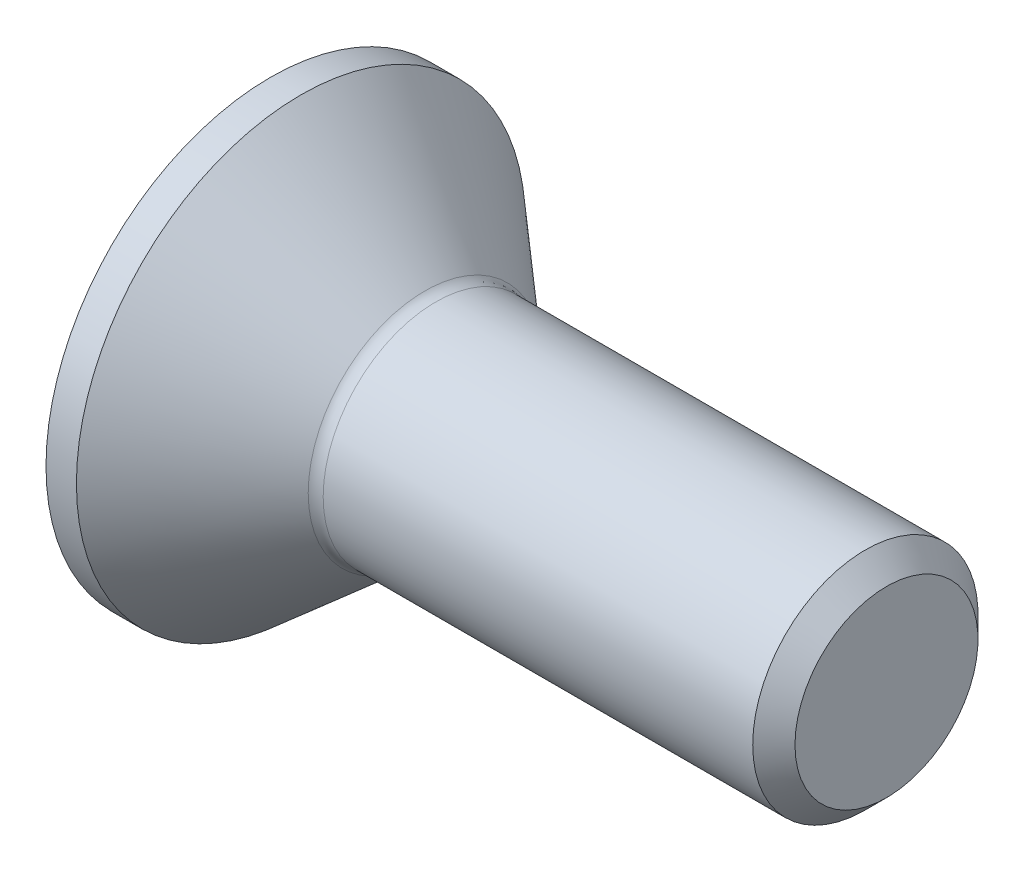
ISO-10303-21;
HEADER;
FILE_DESCRIPTION(('STEP AP214'),'2;1');
FILE_NAME('part.step','',(''),(''),'','','');
FILE_SCHEMA(('AUTOMOTIVE_DESIGN { 1 0 10303 214 1 1 1 1 }'));
ENDSEC;
DATA;
#1=APPLICATION_CONTEXT('core data for automotive mechanical design processes');
#2=APPLICATION_PROTOCOL_DEFINITION('international standard','automotive_design',2000,#1);
#3=PRODUCT_CONTEXT('',#1,'mechanical');
#4=PRODUCT('Part','Part','',(#3));
#5=PRODUCT_RELATED_PRODUCT_CATEGORY('part','',(#4));
#6=PRODUCT_DEFINITION_FORMATION('','',#4);
#7=PRODUCT_DEFINITION_CONTEXT('part definition',#1,'design');
#8=PRODUCT_DEFINITION('design','',#6,#7);
#9=PRODUCT_DEFINITION_SHAPE('','',#8);
#10=(LENGTH_UNIT() NAMED_UNIT(*) SI_UNIT(.MILLI.,.METRE.));
#11=(NAMED_UNIT(*) PLANE_ANGLE_UNIT() SI_UNIT($,.RADIAN.));
#12=(NAMED_UNIT(*) SI_UNIT($,.STERADIAN.) SOLID_ANGLE_UNIT());
#13=UNCERTAINTY_MEASURE_WITH_UNIT(LENGTH_MEASURE(1.E-05),#10,'distance_accuracy_value','');
#14=(GEOMETRIC_REPRESENTATION_CONTEXT(3) GLOBAL_UNCERTAINTY_ASSIGNED_CONTEXT((#13)) GLOBAL_UNIT_ASSIGNED_CONTEXT((#10,
#11,#12)) REPRESENTATION_CONTEXT('',''));
#15=CARTESIAN_POINT('',(0.,0.,0.));
#16=DIRECTION('',(0.,0.,1.));
#17=DIRECTION('',(1.,0.,0.));
#18=AXIS2_PLACEMENT_3D('',#15,#16,#17);
#19=CARTESIAN_POINT('',(1.9304,-1.3748153285078,0.));
#20=DIRECTION('',(-1.,0.,0.));
#21=DIRECTION('',(0.,0.,1.));
#22=AXIS2_PLACEMENT_3D('',#19,#20,#21);
#23=PLANE('',#22);
#24=DIRECTION('',(0.,-0.5,-0.866025403784439));
#25=VECTOR('',#24,1.);
#26=CARTESIAN_POINT('',(1.9304,0.687407664253898,-1.190625));
#27=LINE('',#26,#25);
#28=CARTESIAN_POINT('',(1.9304,0.687407664253898,-1.190625));
#29=VERTEX_POINT('',#28);
#30=CARTESIAN_POINT('',(1.93039999998721,1.03111149637758,-0.595312499998113));
#31=VERTEX_POINT('',#30);
#32=EDGE_CURVE('E88',#29,#31,#27,.F.);
#33=ORIENTED_EDGE('',*,*,#32,.F.);
#34=DIRECTION('',(0.,1.,0.));
#35=VECTOR('',#34,1.);
#36=CARTESIAN_POINT('',(1.9304,-0.687407664253898,-1.190625));
#37=LINE('',#36,#35);
#38=CARTESIAN_POINT('',(1.93040000001363,0.,-1.19062499994127));
#39=VERTEX_POINT('',#38);
#40=EDGE_CURVE('E84',#39,#29,#37,.T.);
#41=ORIENTED_EDGE('',*,*,#40,.F.);
#42=CARTESIAN_POINT('',(1.93039999997442,0.,0.));
#43=DIRECTION('',(-1.,0.,0.));
#44=DIRECTION('',(0.,0.,1.));
#45=AXIS2_PLACEMENT_3D('',#42,#43,#44);
#46=CIRCLE('',#45,1.19062499999245);
#47=EDGE_CURVE('E20',#39,#31,#46,.F.);
#48=ORIENTED_EDGE('',*,*,#47,.T.);
#49=EDGE_LOOP('',(#33,#41,#48));
#50=FACE_BOUND('',#49,.T.);
#51=ADVANCED_FACE('F17',(#50),#23,.T.);
#52=CARTESIAN_POINT('',(1.9304,-1.3748153285078,0.));
#53=DIRECTION('',(-1.,0.,0.));
#54=DIRECTION('',(0.,0.,1.));
#55=AXIS2_PLACEMENT_3D('',#52,#53,#54);
#56=PLANE('',#55);
#57=DIRECTION('',(0.,1.,0.));
#58=VECTOR('',#57,1.);
#59=CARTESIAN_POINT('',(1.9304,-0.687407664253898,-1.190625));
#60=LINE('',#59,#58);
#61=CARTESIAN_POINT('',(1.9304,-0.687407664253898,-1.190625));
#62=VERTEX_POINT('',#61);
#63=EDGE_CURVE('E94',#62,#39,#60,.T.);
#64=ORIENTED_EDGE('',*,*,#63,.F.);
#65=DIRECTION('',(0.,-0.500000000000001,0.866025403784438));
#66=VECTOR('',#65,1.);
#67=CARTESIAN_POINT('',(1.9304,-1.3748153285078,0.));
#68=LINE('',#67,#66);
#69=CARTESIAN_POINT('',(1.93039999998721,-1.03111149637758,-0.595312499998114));
#70=VERTEX_POINT('',#69);
#71=EDGE_CURVE('E110',#70,#62,#68,.F.);
#72=ORIENTED_EDGE('',*,*,#71,.F.);
#73=CARTESIAN_POINT('',(1.93039999997442,0.,0.));
#74=DIRECTION('',(-1.,0.,0.));
#75=DIRECTION('',(0.,0.,1.));
#76=AXIS2_PLACEMENT_3D('',#73,#74,#75);
#77=CIRCLE('',#76,1.19062499999245);
#78=EDGE_CURVE('E100',#70,#39,#77,.F.);
#79=ORIENTED_EDGE('',*,*,#78,.T.);
#80=EDGE_LOOP('',(#64,#72,#79));
#81=FACE_BOUND('',#80,.T.);
#82=ADVANCED_FACE('F107',(#81),#56,.T.);
#83=CARTESIAN_POINT('',(1.9304,-0.687407664253898,-1.190625));
#84=DIRECTION('',(0.,0.,1.));
#85=DIRECTION('',(1.,0.,0.));
#86=AXIS2_PLACEMENT_3D('',#83,#84,#85);
#87=PLANE('',#86);
#88=ORIENTED_EDGE('',*,*,#40,.T.);
#89=DIRECTION('',(1.,0.,0.));
#90=VECTOR('',#89,1.);
#91=CARTESIAN_POINT('',(1.9304,0.687407664253898,-1.190625));
#92=LINE('',#91,#90);
#93=CARTESIAN_POINT('',(0.,0.687407664253898,-1.190625));
#94=VERTEX_POINT('',#93);
#95=EDGE_CURVE('E128',#94,#29,#92,.T.);
#96=ORIENTED_EDGE('',*,*,#95,.F.);
#97=DIRECTION('',(0.,1.,0.));
#98=VECTOR('',#97,1.);
#99=CARTESIAN_POINT('',(0.,-0.687407664253898,-1.190625));
#100=LINE('',#99,#98);
#101=CARTESIAN_POINT('',(0.,-0.687407664253898,-1.190625));
#102=VERTEX_POINT('',#101);
#103=EDGE_CURVE('E118',#94,#102,#100,.F.);
#104=ORIENTED_EDGE('',*,*,#103,.T.);
#105=DIRECTION('',(1.,0.,0.));
#106=VECTOR('',#105,1.);
#107=CARTESIAN_POINT('',(1.9304,-0.687407664253898,-1.190625));
#108=LINE('',#107,#106);
#109=EDGE_CURVE('E117',#62,#102,#108,.F.);
#110=ORIENTED_EDGE('',*,*,#109,.F.);
#111=ORIENTED_EDGE('',*,*,#63,.T.);
#112=EDGE_LOOP('',(#88,#96,#104,#110,#111));
#113=FACE_BOUND('',#112,.T.);
#114=ADVANCED_FACE('F114',(#113),#87,.T.);
#115=CARTESIAN_POINT('',(1.9304,0.687407664253898,-1.190625));
#116=DIRECTION('',(0.,-0.866025403784439,0.5));
#117=DIRECTION('',(0.,-0.5,-0.866025403784439));
#118=AXIS2_PLACEMENT_3D('',#115,#116,#117);
#119=PLANE('',#118);
#120=DIRECTION('',(0.,-0.5,-0.866025403784438));
#121=VECTOR('',#120,1.);
#122=CARTESIAN_POINT('',(1.9304,1.3748153285078,0.));
#123=LINE('',#122,#121);
#124=CARTESIAN_POINT('',(1.9304,1.3748153285078,0.));
#125=VERTEX_POINT('',#124);
#126=EDGE_CURVE('E104',#125,#31,#123,.T.);
#127=ORIENTED_EDGE('',*,*,#126,.F.);
#128=DIRECTION('',(1.,0.,0.));
#129=VECTOR('',#128,1.);
#130=CARTESIAN_POINT('',(1.9304,1.3748153285078,0.));
#131=LINE('',#130,#129);
#132=CARTESIAN_POINT('',(0.,1.3748153285078,0.));
#133=VERTEX_POINT('',#132);
#134=EDGE_CURVE('E175',#133,#125,#131,.T.);
#135=ORIENTED_EDGE('',*,*,#134,.F.);
#136=DIRECTION('',(0.,-0.5,-0.866025403784439));
#137=VECTOR('',#136,1.);
#138=CARTESIAN_POINT('',(0.,0.687407664253898,-1.190625));
#139=LINE('',#138,#137);
#140=EDGE_CURVE('E93',#133,#94,#139,.T.);
#141=ORIENTED_EDGE('',*,*,#140,.T.);
#142=ORIENTED_EDGE('',*,*,#95,.T.);
#143=ORIENTED_EDGE('',*,*,#32,.T.);
#144=EDGE_LOOP('',(#127,#135,#141,#142,#143));
#145=FACE_BOUND('',#144,.T.);
#146=ADVANCED_FACE('F313',(#145),#119,.T.);
#147=CARTESIAN_POINT('',(1.9304,-1.3748153285078,0.));
#148=DIRECTION('',(-1.,0.,0.));
#149=DIRECTION('',(0.,0.,1.));
#150=AXIS2_PLACEMENT_3D('',#147,#148,#149);
#151=PLANE('',#150);
#152=DIRECTION('',(0.,0.5,-0.866025403784439));
#153=VECTOR('',#152,1.);
#154=CARTESIAN_POINT('',(1.9304,1.3748153285078,0.));
#155=LINE('',#154,#153);
#156=CARTESIAN_POINT('',(1.93039999998721,1.03111149637758,0.595312499998113));
#157=VERTEX_POINT('',#156);
#158=EDGE_CURVE('E161',#125,#157,#155,.F.);
#159=ORIENTED_EDGE('',*,*,#158,.F.);
#160=ORIENTED_EDGE('',*,*,#126,.T.);
#161=CARTESIAN_POINT('',(1.93039999997442,0.,0.));
#162=DIRECTION('',(-1.,0.,0.));
#163=DIRECTION('',(0.,0.,1.));
#164=AXIS2_PLACEMENT_3D('',#161,#162,#163);
#165=CIRCLE('',#164,1.19062499999245);
#166=EDGE_CURVE('E103',#31,#157,#165,.F.);
#167=ORIENTED_EDGE('',*,*,#166,.T.);
#168=EDGE_LOOP('',(#159,#160,#167));
#169=FACE_BOUND('',#168,.T.);
#170=ADVANCED_FACE('F164',(#169),#151,.T.);
#171=CARTESIAN_POINT('',(1.93040000010569,0.,0.));
#172=DIRECTION('',(-1.,0.,0.));
#173=DIRECTION('',(0.,0.,1.));
#174=AXIS2_PLACEMENT_3D('',#171,#172,#173);
#175=CONICAL_SURFACE('',#174,1.19062499976508,1.04719755094816);
#176=CARTESIAN_POINT('',(2.61780766436459,0.,-2.8421709430404E-10));
#177=VERTEX_POINT('',#176);
#178=VERTEX_LOOP('',#177);
#179=FACE_BOUND('',#178,.T.);
#180=ORIENTED_EDGE('',*,*,#47,.F.);
#181=ORIENTED_EDGE('',*,*,#78,.F.);
#182=CARTESIAN_POINT('',(1.93039999997442,0.,0.));
#183=DIRECTION('',(-1.,0.,0.));
#184=DIRECTION('',(0.,0.,1.));
#185=AXIS2_PLACEMENT_3D('',#182,#183,#184);
#186=CIRCLE('',#185,1.19062499999245);
#187=CARTESIAN_POINT('',(1.93039999998721,-1.03111149637758,0.595312499998113));
#188=VERTEX_POINT('',#187);
#189=EDGE_CURVE('E112',#188,#70,#186,.F.);
#190=ORIENTED_EDGE('',*,*,#189,.F.);
#191=CARTESIAN_POINT('',(1.93039999997442,0.,0.));
#192=DIRECTION('',(-1.,0.,0.));
#193=DIRECTION('',(0.,0.,1.));
#194=AXIS2_PLACEMENT_3D('',#191,#192,#193);
#195=CIRCLE('',#194,1.19062499999245);
#196=CARTESIAN_POINT('',(1.93039999998721,0.,1.19062499999623));
#197=VERTEX_POINT('',#196);
#198=EDGE_CURVE('E153',#197,#188,#195,.F.);
#199=ORIENTED_EDGE('',*,*,#198,.F.);
#200=CARTESIAN_POINT('',(1.93039999997442,0.,0.));
#201=DIRECTION('',(-1.,0.,0.));
#202=DIRECTION('',(0.,0.,1.));
#203=AXIS2_PLACEMENT_3D('',#200,#201,#202);
#204=CIRCLE('',#203,1.19062499999245);
#205=EDGE_CURVE('E158',#157,#197,#204,.F.);
#206=ORIENTED_EDGE('',*,*,#205,.F.);
#207=ORIENTED_EDGE('',*,*,#166,.F.);
#208=EDGE_LOOP('',(#180,#181,#190,#199,#206,#207));
#209=FACE_BOUND('',#208,.T.);
#210=ADVANCED_FACE('F99',(#179,#209),#175,.F.);
#211=CARTESIAN_POINT('',(1.9304,-1.3748153285078,0.));
#212=DIRECTION('',(-1.,0.,0.));
#213=DIRECTION('',(0.,0.,1.));
#214=AXIS2_PLACEMENT_3D('',#211,#212,#213);
#215=PLANE('',#214);
#216=DIRECTION('',(0.,-0.500000000000001,0.866025403784438));
#217=VECTOR('',#216,1.);
#218=CARTESIAN_POINT('',(1.9304,-1.3748153285078,0.));
#219=LINE('',#218,#217);
#220=CARTESIAN_POINT('',(1.9304,-1.3748153285078,0.));
#221=VERTEX_POINT('',#220);
#222=EDGE_CURVE('E141',#221,#70,#219,.F.);
#223=ORIENTED_EDGE('',*,*,#222,.F.);
#224=DIRECTION('',(0.,0.5,0.866025403784438));
#225=VECTOR('',#224,1.);
#226=CARTESIAN_POINT('',(1.9304,-0.687407664253898,1.190625));
#227=LINE('',#226,#225);
#228=EDGE_CURVE('E200',#188,#221,#227,.F.);
#229=ORIENTED_EDGE('',*,*,#228,.F.);
#230=ORIENTED_EDGE('',*,*,#189,.T.);
#231=EDGE_LOOP('',(#223,#229,#230));
#232=FACE_BOUND('',#231,.T.);
#233=ADVANCED_FACE('F232',(#232),#215,.T.);
#234=CARTESIAN_POINT('',(1.9304,-1.3748153285078,0.));
#235=DIRECTION('',(0.,0.866025403784438,0.500000000000001));
#236=DIRECTION('',(0.,-0.500000000000001,0.866025403784438));
#237=AXIS2_PLACEMENT_3D('',#234,#235,#236);
#238=PLANE('',#237);
#239=ORIENTED_EDGE('',*,*,#71,.T.);
#240=ORIENTED_EDGE('',*,*,#109,.T.);
#241=DIRECTION('',(0.,-0.500000000000001,0.866025403784438));
#242=VECTOR('',#241,1.);
#243=CARTESIAN_POINT('',(0.,-1.3748153285078,0.));
#244=LINE('',#243,#242);
#245=CARTESIAN_POINT('',(0.,-1.3748153285078,0.));
#246=VERTEX_POINT('',#245);
#247=EDGE_CURVE('E138',#102,#246,#244,.T.);
#248=ORIENTED_EDGE('',*,*,#247,.T.);
#249=DIRECTION('',(1.,0.,0.));
#250=VECTOR('',#249,1.);
#251=CARTESIAN_POINT('',(1.9304,-1.3748153285078,0.));
#252=LINE('',#251,#250);
#253=EDGE_CURVE('E190',#221,#246,#252,.F.);
#254=ORIENTED_EDGE('',*,*,#253,.F.);
#255=ORIENTED_EDGE('',*,*,#222,.T.);
#256=EDGE_LOOP('',(#239,#240,#248,#254,#255));
#257=FACE_BOUND('',#256,.T.);
#258=ADVANCED_FACE('F228',(#257),#238,.T.);
#259=CARTESIAN_POINT('',(1.9304,1.3748153285078,0.));
#260=DIRECTION('',(0.,-0.866025403784439,-0.5));
#261=DIRECTION('',(0.,0.5,-0.866025403784439));
#262=AXIS2_PLACEMENT_3D('',#259,#260,#261);
#263=PLANE('',#262);
#264=DIRECTION('',(0.,0.5,-0.866025403784438));
#265=VECTOR('',#264,1.);
#266=CARTESIAN_POINT('',(1.9304,0.687407664253898,1.190625));
#267=LINE('',#266,#265);
#268=CARTESIAN_POINT('',(1.9304,0.687407664253898,1.190625));
#269=VERTEX_POINT('',#268);
#270=EDGE_CURVE('E157',#269,#157,#267,.T.);
#271=ORIENTED_EDGE('',*,*,#270,.F.);
#272=DIRECTION('',(-1.,0.,0.));
#273=VECTOR('',#272,1.);
#274=CARTESIAN_POINT('',(1.9304,0.687407664253898,1.190625));
#275=LINE('',#274,#273);
#276=CARTESIAN_POINT('',(0.,0.687407664253898,1.190625));
#277=VERTEX_POINT('',#276);
#278=EDGE_CURVE('E188',#277,#269,#275,.F.);
#279=ORIENTED_EDGE('',*,*,#278,.F.);
#280=DIRECTION('',(0.,0.5,-0.866025403784439));
#281=VECTOR('',#280,1.);
#282=CARTESIAN_POINT('',(0.,1.3748153285078,0.));
#283=LINE('',#282,#281);
#284=EDGE_CURVE('E35',#277,#133,#283,.T.);
#285=ORIENTED_EDGE('',*,*,#284,.T.);
#286=ORIENTED_EDGE('',*,*,#134,.T.);
#287=ORIENTED_EDGE('',*,*,#158,.T.);
#288=EDGE_LOOP('',(#271,#279,#285,#286,#287));
#289=FACE_BOUND('',#288,.T.);
#290=ADVANCED_FACE('F173',(#289),#263,.T.);
#291=CARTESIAN_POINT('',(1.9304,-1.3748153285078,0.));
#292=DIRECTION('',(-1.,0.,0.));
#293=DIRECTION('',(0.,0.,1.));
#294=AXIS2_PLACEMENT_3D('',#291,#292,#293);
#295=PLANE('',#294);
#296=DIRECTION('',(0.,1.,0.));
#297=VECTOR('',#296,1.);
#298=CARTESIAN_POINT('',(1.9304,0.687407664253898,1.190625));
#299=LINE('',#298,#297);
#300=EDGE_CURVE('E179',#269,#197,#299,.F.);
#301=ORIENTED_EDGE('',*,*,#300,.F.);
#302=ORIENTED_EDGE('',*,*,#270,.T.);
#303=ORIENTED_EDGE('',*,*,#205,.T.);
#304=EDGE_LOOP('',(#301,#302,#303));
#305=FACE_BOUND('',#304,.T.);
#306=ADVANCED_FACE('F177',(#305),#295,.T.);
#307=CARTESIAN_POINT('',(1.9304,-1.3748153285078,0.));
#308=DIRECTION('',(-1.,0.,0.));
#309=DIRECTION('',(0.,0.,1.));
#310=AXIS2_PLACEMENT_3D('',#307,#308,#309);
#311=PLANE('',#310);
#312=DIRECTION('',(0.,0.5,0.866025403784438));
#313=VECTOR('',#312,1.);
#314=CARTESIAN_POINT('',(1.9304,-0.687407664253898,1.190625));
#315=LINE('',#314,#313);
#316=CARTESIAN_POINT('',(1.9304,-0.687407664253898,1.190625));
#317=VERTEX_POINT('',#316);
#318=EDGE_CURVE('E203',#317,#188,#315,.F.);
#319=ORIENTED_EDGE('',*,*,#318,.F.);
#320=DIRECTION('',(0.,1.,0.));
#321=VECTOR('',#320,1.);
#322=CARTESIAN_POINT('',(1.9304,0.687407664253898,1.190625));
#323=LINE('',#322,#321);
#324=EDGE_CURVE('E239',#197,#317,#323,.F.);
#325=ORIENTED_EDGE('',*,*,#324,.F.);
#326=ORIENTED_EDGE('',*,*,#198,.T.);
#327=EDGE_LOOP('',(#319,#325,#326));
#328=FACE_BOUND('',#327,.T.);
#329=ADVANCED_FACE('F236',(#328),#311,.T.);
#330=CARTESIAN_POINT('',(1.9304,-0.687407664253898,1.190625));
#331=DIRECTION('',(0.,0.866025403784438,-0.5));
#332=DIRECTION('',(0.,0.5,0.866025403784438));
#333=AXIS2_PLACEMENT_3D('',#330,#331,#332);
#334=PLANE('',#333);
#335=ORIENTED_EDGE('',*,*,#228,.T.);
#336=ORIENTED_EDGE('',*,*,#253,.T.);
#337=DIRECTION('',(0.,0.5,0.866025403784438));
#338=VECTOR('',#337,1.);
#339=CARTESIAN_POINT('',(0.,-0.687407664253898,1.190625));
#340=LINE('',#339,#338);
#341=CARTESIAN_POINT('',(0.,-0.687407664253898,1.190625));
#342=VERTEX_POINT('',#341);
#343=EDGE_CURVE('E156',#246,#342,#340,.T.);
#344=ORIENTED_EDGE('',*,*,#343,.T.);
#345=DIRECTION('',(-1.,0.,0.));
#346=VECTOR('',#345,1.);
#347=CARTESIAN_POINT('',(1.9304,-0.687407664253898,1.190625));
#348=LINE('',#347,#346);
#349=EDGE_CURVE('E197',#317,#342,#348,.T.);
#350=ORIENTED_EDGE('',*,*,#349,.F.);
#351=ORIENTED_EDGE('',*,*,#318,.T.);
#352=EDGE_LOOP('',(#335,#336,#344,#350,#351));
#353=FACE_BOUND('',#352,.T.);
#354=ADVANCED_FACE('F257',(#353),#334,.T.);
#355=CARTESIAN_POINT('',(1.9304,0.687407664253898,1.190625));
#356=DIRECTION('',(0.,0.,-1.));
#357=DIRECTION('',(-1.,0.,0.));
#358=AXIS2_PLACEMENT_3D('',#355,#356,#357);
#359=PLANE('',#358);
#360=ORIENTED_EDGE('',*,*,#324,.T.);
#361=ORIENTED_EDGE('',*,*,#349,.T.);
#362=DIRECTION('',(0.,1.,0.));
#363=VECTOR('',#362,1.);
#364=CARTESIAN_POINT('',(0.,0.,1.190625));
#365=LINE('',#364,#363);
#366=EDGE_CURVE('E152',#277,#342,#365,.F.);
#367=ORIENTED_EDGE('',*,*,#366,.F.);
#368=ORIENTED_EDGE('',*,*,#278,.T.);
#369=ORIENTED_EDGE('',*,*,#300,.T.);
#370=EDGE_LOOP('',(#360,#361,#367,#368,#369));
#371=FACE_BOUND('',#370,.T.);
#372=ADVANCED_FACE('F243',(#371),#359,.T.);
#373=CARTESIAN_POINT('',(0.,0.,0.));
#374=DIRECTION('',(-1.,0.,0.));
#375=DIRECTION('',(0.,0.,1.));
#376=AXIS2_PLACEMENT_3D('',#373,#374,#375);
#377=PLANE('',#376);
#378=ORIENTED_EDGE('',*,*,#284,.F.);
#379=ORIENTED_EDGE('',*,*,#366,.T.);
#380=ORIENTED_EDGE('',*,*,#343,.F.);
#381=ORIENTED_EDGE('',*,*,#247,.F.);
#382=ORIENTED_EDGE('',*,*,#103,.F.);
#383=ORIENTED_EDGE('',*,*,#140,.F.);
#384=EDGE_LOOP('',(#378,#379,#380,#381,#382,#383));
#385=FACE_BOUND('',#384,.T.);
#386=CARTESIAN_POINT('',(0.,0.,0.));
#387=DIRECTION('',(-1.,0.,0.));
#388=DIRECTION('',(0.,0.,1.));
#389=AXIS2_PLACEMENT_3D('',#386,#387,#388);
#390=CIRCLE('',#389,4.05);
#391=CARTESIAN_POINT('',(0.,0.,4.05));
#392=VERTEX_POINT('',#391);
#393=EDGE_CURVE('E149',#392,#392,#390,.F.);
#394=ORIENTED_EDGE('',*,*,#393,.F.);
#395=EDGE_LOOP('',(#394));
#396=FACE_BOUND('',#395,.T.);
#397=ADVANCED_FACE('F258',(#385,#396),#377,.T.);
#398=CARTESIAN_POINT('',(0.,0.,0.));
#399=DIRECTION('',(-1.,0.,0.));
#400=DIRECTION('',(0.,0.,1.));
#401=AXIS2_PLACEMENT_3D('',#398,#399,#400);
#402=CYLINDRICAL_SURFACE('',#401,4.05);
#403=ORIENTED_EDGE('',*,*,#393,.T.);
#404=EDGE_LOOP('',(#403));
#405=FACE_BOUND('',#404,.T.);
#406=CARTESIAN_POINT('',(0.548756554280772,0.,0.));
#407=DIRECTION('',(-1.,0.,0.));
#408=DIRECTION('',(0.,0.,1.));
#409=AXIS2_PLACEMENT_3D('',#406,#407,#408);
#410=CIRCLE('',#409,4.05000000000655);
#411=CARTESIAN_POINT('',(0.548756554280772,0.,4.05000000000655));
#412=VERTEX_POINT('',#411);
#413=EDGE_CURVE('E148',#412,#412,#410,.F.);
#414=ORIENTED_EDGE('',*,*,#413,.F.);
#415=EDGE_LOOP('',(#414));
#416=FACE_BOUND('',#415,.T.);
#417=ADVANCED_FACE('F261',(#405,#416),#402,.T.);
#418=CARTESIAN_POINT('',(11.1125,1.651,0.));
#419=DIRECTION('',(1.,0.,0.));
#420=DIRECTION('',(0.,0.,-1.));
#421=AXIS2_PLACEMENT_3D('',#418,#419,#420);
#422=PLANE('',#421);
#423=CARTESIAN_POINT('',(11.1125000000243,0.,0.));
#424=DIRECTION('',(-1.,0.,0.));
#425=DIRECTION('',(0.,0.,1.));
#426=AXIS2_PLACEMENT_3D('',#423,#424,#425);
#427=CIRCLE('',#426,1.65100000009488);
#428=CARTESIAN_POINT('',(11.1125000000243,0.,1.65100000009488));
#429=VERTEX_POINT('',#428);
#430=EDGE_CURVE('E144',#429,#429,#427,.T.);
#431=ORIENTED_EDGE('',*,*,#430,.F.);
#432=EDGE_LOOP('',(#431));
#433=FACE_BOUND('',#432,.T.);
#434=ADVANCED_FACE('F267',(#433),#422,.T.);
#435=CARTESIAN_POINT('',(0.548756554337615,0.,0.));
#436=DIRECTION('',(-1.,0.,0.));
#437=DIRECTION('',(0.,0.,1.));
#438=AXIS2_PLACEMENT_3D('',#435,#436,#437);
#439=CONICAL_SURFACE('',#438,4.0499999999497,0.715584993321548);
#440=ORIENTED_EDGE('',*,*,#413,.T.);
#441=EDGE_LOOP('',(#440));
#442=FACE_BOUND('',#441,.T.);
#443=CARTESIAN_POINT('',(2.78574400396065,0.,0.));
#444=DIRECTION('',(-1.,0.,0.));
#445=DIRECTION('',(0.,0.,1.));
#446=AXIS2_PLACEMENT_3D('',#443,#444,#445);
#447=CIRCLE('',#446,2.10541647728606);
#448=CARTESIAN_POINT('',(2.78574400396065,0.,2.10541647728606));
#449=VERTEX_POINT('',#448);
#450=EDGE_CURVE('E147',#449,#449,#447,.T.);
#451=ORIENTED_EDGE('',*,*,#450,.T.);
#452=EDGE_LOOP('',(#451));
#453=FACE_BOUND('',#452,.T.);
#454=ADVANCED_FACE('F287',(#442,#453),#439,.T.);
#455=CARTESIAN_POINT('',(10.7315000000199,0.,0.));
#456=DIRECTION('',(-1.,0.,0.));
#457=DIRECTION('',(0.,0.,1.));
#458=AXIS2_PLACEMENT_3D('',#455,#456,#457);
#459=CONICAL_SURFACE('',#458,2.03200000004244,0.785398163322851);
#460=CARTESIAN_POINT('',(10.7315,0.,0.));
#461=DIRECTION('',(-1.,0.,0.));
#462=DIRECTION('',(0.,0.,1.));
#463=AXIS2_PLACEMENT_3D('',#460,#461,#462);
#464=CIRCLE('',#463,2.032);
#465=CARTESIAN_POINT('',(10.7315,0.,2.032));
#466=VERTEX_POINT('',#465);
#467=EDGE_CURVE('E26',#466,#466,#464,.T.);
#468=ORIENTED_EDGE('',*,*,#467,.F.);
#469=EDGE_LOOP('',(#468));
#470=FACE_BOUND('',#469,.T.);
#471=ORIENTED_EDGE('',*,*,#430,.T.);
#472=EDGE_LOOP('',(#471));
#473=FACE_BOUND('',#472,.T.);
#474=ADVANCED_FACE('F283',(#470,#473),#459,.T.);
#475=CARTESIAN_POINT('',(2.98210529211835,0.,0.));
#476=DIRECTION('',(-1.,0.,0.));
#477=DIRECTION('',(0.,0.,1.));
#478=AXIS2_PLACEMENT_3D('',#475,#476,#477);
#479=TOROIDAL_SURFACE('',#478,2.33130429958391,0.299304299583911);
#480=ORIENTED_EDGE('',*,*,#450,.F.);
#481=EDGE_LOOP('',(#480));
#482=FACE_BOUND('',#481,.T.);
#483=CARTESIAN_POINT('',(2.98210529211835,0.,0.));
#484=DIRECTION('',(-1.,0.,0.));
#485=DIRECTION('',(0.,0.,1.));
#486=AXIS2_PLACEMENT_3D('',#483,#484,#485);
#487=CIRCLE('',#486,2.032);
#488=CARTESIAN_POINT('',(2.98210529211835,0.,2.032));
#489=VERTEX_POINT('',#488);
#490=EDGE_CURVE('E11',#489,#489,#487,.F.);
#491=ORIENTED_EDGE('',*,*,#490,.F.);
#492=EDGE_LOOP('',(#491));
#493=FACE_BOUND('',#492,.T.);
#494=ADVANCED_FACE('F278',(#482,#493),#479,.F.);
#495=CARTESIAN_POINT('',(0.,0.,0.));
#496=DIRECTION('',(-1.,0.,0.));
#497=DIRECTION('',(0.,0.,1.));
#498=AXIS2_PLACEMENT_3D('',#495,#496,#497);
#499=CYLINDRICAL_SURFACE('',#498,2.032);
#500=ORIENTED_EDGE('',*,*,#490,.T.);
#501=EDGE_LOOP('',(#500));
#502=FACE_BOUND('',#501,.T.);
#503=ORIENTED_EDGE('',*,*,#467,.T.);
#504=EDGE_LOOP('',(#503));
#505=FACE_BOUND('',#504,.T.);
#506=ADVANCED_FACE('F282',(#502,#505),#499,.T.);
#507=CLOSED_SHELL('',(#51,#82,#114,#146,#170,#210,#233,#258,#290,#306,#329,#354,#372,#397,#417,
#434,#454,#474,#494,#506));
#508=MANIFOLD_SOLID_BREP('B1',#507);
#509=ADVANCED_BREP_SHAPE_REPRESENTATION('',(#18,#508),#14);
#510=SHAPE_DEFINITION_REPRESENTATION(#9,#509);
ENDSEC;
END-ISO-10303-21;
